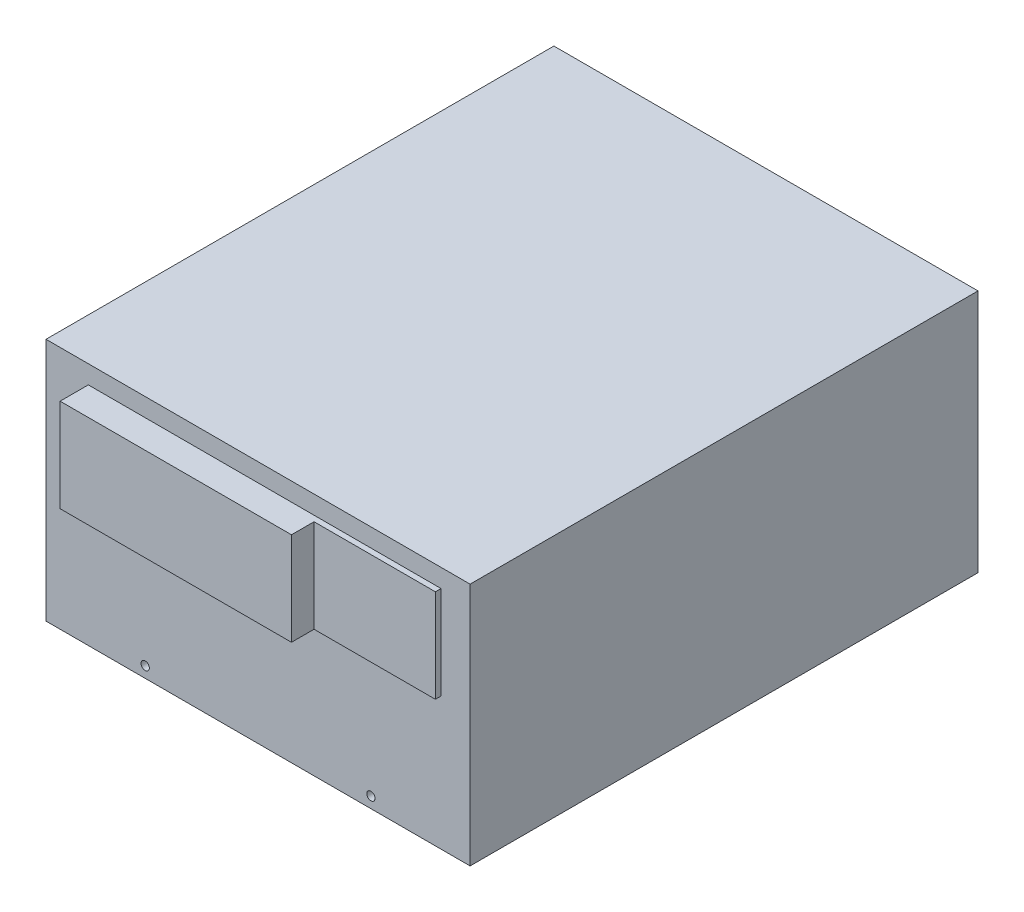
ISO-10303-21;
HEADER;
FILE_DESCRIPTION(('STEP AP214'),'2;1');
FILE_NAME('part.step','',(''),(''),'','','');
FILE_SCHEMA(('AUTOMOTIVE_DESIGN { 1 0 10303 214 1 1 1 1 }'));
ENDSEC;
DATA;
#1=APPLICATION_CONTEXT('core data for automotive mechanical design processes');
#2=APPLICATION_PROTOCOL_DEFINITION('international standard','automotive_design',2000,#1);
#3=PRODUCT_CONTEXT('',#1,'mechanical');
#4=PRODUCT('Part','Part','',(#3));
#5=PRODUCT_RELATED_PRODUCT_CATEGORY('part','',(#4));
#6=PRODUCT_DEFINITION_FORMATION('','',#4);
#7=PRODUCT_DEFINITION_CONTEXT('part definition',#1,'design');
#8=PRODUCT_DEFINITION('design','',#6,#7);
#9=PRODUCT_DEFINITION_SHAPE('','',#8);
#10=(LENGTH_UNIT() NAMED_UNIT(*) SI_UNIT(.MILLI.,.METRE.));
#11=(NAMED_UNIT(*) PLANE_ANGLE_UNIT() SI_UNIT($,.RADIAN.));
#12=(NAMED_UNIT(*) SI_UNIT($,.STERADIAN.) SOLID_ANGLE_UNIT());
#13=UNCERTAINTY_MEASURE_WITH_UNIT(LENGTH_MEASURE(1.E-05),#10,'distance_accuracy_value','');
#14=(GEOMETRIC_REPRESENTATION_CONTEXT(3) GLOBAL_UNCERTAINTY_ASSIGNED_CONTEXT((#13)) GLOBAL_UNIT_ASSIGNED_CONTEXT((#10,
#11,#12)) REPRESENTATION_CONTEXT('',''));
#15=CARTESIAN_POINT('',(0.,0.,0.));
#16=DIRECTION('',(0.,0.,1.));
#17=DIRECTION('',(1.,0.,0.));
#18=AXIS2_PLACEMENT_3D('',#15,#16,#17);
#19=CARTESIAN_POINT('',(0.,0.,0.));
#20=DIRECTION('',(0.,0.,1.));
#21=DIRECTION('',(1.,0.,0.));
#22=AXIS2_PLACEMENT_3D('',#19,#20,#21);
#23=PLANE('',#22);
#24=CARTESIAN_POINT('',(115.15,3.89,0.));
#25=DIRECTION('',(0.,0.,1.));
#26=DIRECTION('',(1.,0.,0.));
#27=AXIS2_PLACEMENT_3D('',#24,#25,#26);
#28=CIRCLE('',#27,1.47000000000001);
#29=CARTESIAN_POINT('',(116.62,3.89,0.));
#30=VERTEX_POINT('',#29);
#31=EDGE_CURVE('E171',#30,#30,#28,.F.);
#32=ORIENTED_EDGE('',*,*,#31,.T.);
#33=EDGE_LOOP('',(#32));
#34=FACE_BOUND('',#33,.T.);
#35=DIRECTION('',(1.,0.,0.));
#36=VECTOR('',#35,1.);
#37=CARTESIAN_POINT('',(0.,0.,0.));
#38=LINE('',#37,#36);
#39=CARTESIAN_POINT('',(0.,0.,0.));
#40=VERTEX_POINT('',#39);
#41=CARTESIAN_POINT('',(150.3,0.,0.));
#42=VERTEX_POINT('',#41);
#43=EDGE_CURVE('E175',#40,#42,#38,.T.);
#44=ORIENTED_EDGE('',*,*,#43,.T.);
#45=DIRECTION('',(0.,1.,0.));
#46=VECTOR('',#45,1.);
#47=CARTESIAN_POINT('',(150.3,0.,0.));
#48=LINE('',#47,#46);
#49=CARTESIAN_POINT('',(150.3,86.5,0.));
#50=VERTEX_POINT('',#49);
#51=EDGE_CURVE('E197',#42,#50,#48,.T.);
#52=ORIENTED_EDGE('',*,*,#51,.T.);
#53=DIRECTION('',(1.,0.,0.));
#54=VECTOR('',#53,1.);
#55=CARTESIAN_POINT('',(0.,86.5,0.));
#56=LINE('',#55,#54);
#57=CARTESIAN_POINT('',(0.,86.5,0.));
#58=VERTEX_POINT('',#57);
#59=EDGE_CURVE('E200',#58,#50,#56,.T.);
#60=ORIENTED_EDGE('',*,*,#59,.F.);
#61=DIRECTION('',(0.,1.,0.));
#62=VECTOR('',#61,1.);
#63=CARTESIAN_POINT('',(0.,0.,0.));
#64=LINE('',#63,#62);
#65=EDGE_CURVE('E188',#40,#58,#64,.T.);
#66=ORIENTED_EDGE('',*,*,#65,.F.);
#67=EDGE_LOOP('',(#44,#52,#60,#66));
#68=FACE_BOUND('',#67,.T.);
#69=CARTESIAN_POINT('',(35.15,3.89,0.));
#70=DIRECTION('',(0.,0.,1.));
#71=DIRECTION('',(1.,0.,0.));
#72=AXIS2_PLACEMENT_3D('',#69,#70,#71);
#73=CIRCLE('',#72,1.47);
#74=CARTESIAN_POINT('',(36.62,3.89,0.));
#75=VERTEX_POINT('',#74);
#76=EDGE_CURVE('E176',#75,#75,#73,.T.);
#77=ORIENTED_EDGE('',*,*,#76,.F.);
#78=EDGE_LOOP('',(#77));
#79=FACE_BOUND('',#78,.T.);
#80=DIRECTION('',(-1.,0.,0.));
#81=VECTOR('',#80,1.);
#82=CARTESIAN_POINT('',(0.,80.,0.));
#83=LINE('',#82,#81);
#84=CARTESIAN_POINT('',(140.,80.,0.));
#85=VERTEX_POINT('',#84);
#86=CARTESIAN_POINT('',(15.,80.,0.));
#87=VERTEX_POINT('',#86);
#88=EDGE_CURVE('E67',#85,#87,#83,.T.);
#89=ORIENTED_EDGE('',*,*,#88,.F.);
#90=DIRECTION('',(0.,1.,0.));
#91=VECTOR('',#90,1.);
#92=CARTESIAN_POINT('',(140.,0.,0.));
#93=LINE('',#92,#91);
#94=CARTESIAN_POINT('',(140.,47.,0.));
#95=VERTEX_POINT('',#94);
#96=EDGE_CURVE('E144',#95,#85,#93,.T.);
#97=ORIENTED_EDGE('',*,*,#96,.F.);
#98=DIRECTION('',(1.,0.,0.));
#99=VECTOR('',#98,1.);
#100=CARTESIAN_POINT('',(0.,47.,0.));
#101=LINE('',#100,#99);
#102=CARTESIAN_POINT('',(15.,47.,0.));
#103=VERTEX_POINT('',#102);
#104=EDGE_CURVE('E60',#103,#95,#101,.T.);
#105=ORIENTED_EDGE('',*,*,#104,.F.);
#106=DIRECTION('',(0.,-1.,0.));
#107=VECTOR('',#106,1.);
#108=CARTESIAN_POINT('',(15.,0.,0.));
#109=LINE('',#108,#107);
#110=EDGE_CURVE('E158',#87,#103,#109,.T.);
#111=ORIENTED_EDGE('',*,*,#110,.F.);
#112=EDGE_LOOP('',(#89,#97,#105,#111));
#113=FACE_BOUND('',#112,.T.);
#114=ADVANCED_FACE('F43',(#34,#68,#79,#113),#23,.T.);
#115=CARTESIAN_POINT('',(0.,0.,-180.));
#116=DIRECTION('',(0.,-1.,0.));
#117=DIRECTION('',(0.,0.,-1.));
#118=AXIS2_PLACEMENT_3D('',#115,#116,#117);
#119=PLANE('',#118);
#120=ORIENTED_EDGE('',*,*,#43,.F.);
#121=DIRECTION('',(0.,0.,1.));
#122=VECTOR('',#121,1.);
#123=CARTESIAN_POINT('',(0.,0.,-180.));
#124=LINE('',#123,#122);
#125=CARTESIAN_POINT('',(0.,0.,-180.));
#126=VERTEX_POINT('',#125);
#127=EDGE_CURVE('E11',#126,#40,#124,.T.);
#128=ORIENTED_EDGE('',*,*,#127,.F.);
#129=DIRECTION('',(1.,0.,0.));
#130=VECTOR('',#129,1.);
#131=CARTESIAN_POINT('',(0.,0.,-180.));
#132=LINE('',#131,#130);
#133=CARTESIAN_POINT('',(150.3,0.,-180.));
#134=VERTEX_POINT('',#133);
#135=EDGE_CURVE('E184',#126,#134,#132,.T.);
#136=ORIENTED_EDGE('',*,*,#135,.T.);
#137=DIRECTION('',(0.,0.,1.));
#138=VECTOR('',#137,1.);
#139=CARTESIAN_POINT('',(150.3,0.,-180.));
#140=LINE('',#139,#138);
#141=EDGE_CURVE('E47',#134,#42,#140,.T.);
#142=ORIENTED_EDGE('',*,*,#141,.T.);
#143=EDGE_LOOP('',(#120,#128,#136,#142));
#144=FACE_BOUND('',#143,.T.);
#145=ADVANCED_FACE('F45',(#144),#119,.T.);
#146=CARTESIAN_POINT('',(0.,0.,-180.));
#147=DIRECTION('',(1.,0.,0.));
#148=DIRECTION('',(0.,0.,-1.));
#149=AXIS2_PLACEMENT_3D('',#146,#147,#148);
#150=PLANE('',#149);
#151=ORIENTED_EDGE('',*,*,#65,.T.);
#152=DIRECTION('',(0.,0.,1.));
#153=VECTOR('',#152,1.);
#154=CARTESIAN_POINT('',(0.,86.5,-180.));
#155=LINE('',#154,#153);
#156=CARTESIAN_POINT('',(0.,86.5,-180.));
#157=VERTEX_POINT('',#156);
#158=EDGE_CURVE('E52',#157,#58,#155,.T.);
#159=ORIENTED_EDGE('',*,*,#158,.F.);
#160=DIRECTION('',(0.,1.,0.));
#161=VECTOR('',#160,1.);
#162=CARTESIAN_POINT('',(0.,0.,-180.));
#163=LINE('',#162,#161);
#164=EDGE_CURVE('E193',#126,#157,#163,.T.);
#165=ORIENTED_EDGE('',*,*,#164,.F.);
#166=ORIENTED_EDGE('',*,*,#127,.T.);
#167=EDGE_LOOP('',(#151,#159,#165,#166));
#168=FACE_BOUND('',#167,.T.);
#169=ADVANCED_FACE('F220',(#168),#150,.F.);
#170=CARTESIAN_POINT('',(0.,86.5,-180.));
#171=DIRECTION('',(0.,-1.,0.));
#172=DIRECTION('',(0.,0.,-1.));
#173=AXIS2_PLACEMENT_3D('',#170,#171,#172);
#174=PLANE('',#173);
#175=ORIENTED_EDGE('',*,*,#59,.T.);
#176=DIRECTION('',(0.,0.,1.));
#177=VECTOR('',#176,1.);
#178=CARTESIAN_POINT('',(150.3,86.5,-180.));
#179=LINE('',#178,#177);
#180=CARTESIAN_POINT('',(150.3,86.5,-180.));
#181=VERTEX_POINT('',#180);
#182=EDGE_CURVE('E205',#181,#50,#179,.T.);
#183=ORIENTED_EDGE('',*,*,#182,.F.);
#184=DIRECTION('',(1.,0.,0.));
#185=VECTOR('',#184,1.);
#186=CARTESIAN_POINT('',(0.,86.5,-180.));
#187=LINE('',#186,#185);
#188=EDGE_CURVE('E191',#157,#181,#187,.T.);
#189=ORIENTED_EDGE('',*,*,#188,.F.);
#190=ORIENTED_EDGE('',*,*,#158,.T.);
#191=EDGE_LOOP('',(#175,#183,#189,#190));
#192=FACE_BOUND('',#191,.T.);
#193=ADVANCED_FACE('F224',(#192),#174,.F.);
#194=CARTESIAN_POINT('',(150.3,0.,-180.));
#195=DIRECTION('',(1.,0.,0.));
#196=DIRECTION('',(0.,0.,-1.));
#197=AXIS2_PLACEMENT_3D('',#194,#195,#196);
#198=PLANE('',#197);
#199=ORIENTED_EDGE('',*,*,#51,.F.);
#200=ORIENTED_EDGE('',*,*,#141,.F.);
#201=DIRECTION('',(0.,1.,0.));
#202=VECTOR('',#201,1.);
#203=CARTESIAN_POINT('',(150.3,0.,-180.));
#204=LINE('',#203,#202);
#205=EDGE_CURVE('E187',#134,#181,#204,.T.);
#206=ORIENTED_EDGE('',*,*,#205,.T.);
#207=ORIENTED_EDGE('',*,*,#182,.T.);
#208=EDGE_LOOP('',(#199,#200,#206,#207));
#209=FACE_BOUND('',#208,.T.);
#210=ADVANCED_FACE('F213',(#209),#198,.T.);
#211=CARTESIAN_POINT('',(0.,0.,-180.));
#212=DIRECTION('',(0.,0.,1.));
#213=DIRECTION('',(1.,0.,0.));
#214=AXIS2_PLACEMENT_3D('',#211,#212,#213);
#215=PLANE('',#214);
#216=ORIENTED_EDGE('',*,*,#135,.F.);
#217=ORIENTED_EDGE('',*,*,#164,.T.);
#218=ORIENTED_EDGE('',*,*,#188,.T.);
#219=ORIENTED_EDGE('',*,*,#205,.F.);
#220=EDGE_LOOP('',(#216,#217,#218,#219));
#221=FACE_BOUND('',#220,.T.);
#222=ADVANCED_FACE('F226',(#221),#215,.F.);
#223=CARTESIAN_POINT('',(115.15,3.89,-10.));
#224=DIRECTION('',(0.,0.,1.));
#225=DIRECTION('',(1.,0.,0.));
#226=AXIS2_PLACEMENT_3D('',#223,#224,#225);
#227=CYLINDRICAL_SURFACE('',#226,1.47000000000001);
#228=CARTESIAN_POINT('',(115.15,3.89,-10.));
#229=DIRECTION('',(0.,0.,1.));
#230=DIRECTION('',(1.,0.,0.));
#231=AXIS2_PLACEMENT_3D('',#228,#229,#230);
#232=CIRCLE('',#231,1.47000000000001);
#233=CARTESIAN_POINT('',(116.62,3.89,-10.));
#234=VERTEX_POINT('',#233);
#235=EDGE_CURVE('E179',#234,#234,#232,.F.);
#236=ORIENTED_EDGE('',*,*,#235,.T.);
#237=EDGE_LOOP('',(#236));
#238=FACE_BOUND('',#237,.T.);
#239=ORIENTED_EDGE('',*,*,#31,.F.);
#240=EDGE_LOOP('',(#239));
#241=FACE_BOUND('',#240,.T.);
#242=ADVANCED_FACE('F228',(#238,#241),#227,.F.);
#243=CARTESIAN_POINT('',(0.,0.,-10.));
#244=DIRECTION('',(0.,0.,1.));
#245=DIRECTION('',(1.,0.,0.));
#246=AXIS2_PLACEMENT_3D('',#243,#244,#245);
#247=PLANE('',#246);
#248=ORIENTED_EDGE('',*,*,#235,.F.);
#249=EDGE_LOOP('',(#248));
#250=FACE_BOUND('',#249,.T.);
#251=ADVANCED_FACE('F234',(#250),#247,.T.);
#252=CARTESIAN_POINT('',(35.15,3.89,-10.));
#253=DIRECTION('',(0.,0.,1.));
#254=DIRECTION('',(1.,0.,0.));
#255=AXIS2_PLACEMENT_3D('',#252,#253,#254);
#256=CYLINDRICAL_SURFACE('',#255,1.47);
#257=CARTESIAN_POINT('',(35.15,3.89,-10.));
#258=DIRECTION('',(0.,0.,1.));
#259=DIRECTION('',(1.,0.,0.));
#260=AXIS2_PLACEMENT_3D('',#257,#258,#259);
#261=CIRCLE('',#260,1.47);
#262=CARTESIAN_POINT('',(36.62,3.89,-10.));
#263=VERTEX_POINT('',#262);
#264=EDGE_CURVE('E172',#263,#263,#261,.T.);
#265=ORIENTED_EDGE('',*,*,#264,.F.);
#266=EDGE_LOOP('',(#265));
#267=FACE_BOUND('',#266,.T.);
#268=ORIENTED_EDGE('',*,*,#76,.T.);
#269=EDGE_LOOP('',(#268));
#270=FACE_BOUND('',#269,.T.);
#271=ADVANCED_FACE('F278',(#267,#270),#256,.F.);
#272=CARTESIAN_POINT('',(0.,0.,-10.));
#273=DIRECTION('',(0.,0.,1.));
#274=DIRECTION('',(1.,0.,0.));
#275=AXIS2_PLACEMENT_3D('',#272,#273,#274);
#276=PLANE('',#275);
#277=ORIENTED_EDGE('',*,*,#264,.T.);
#278=EDGE_LOOP('',(#277));
#279=FACE_BOUND('',#278,.T.);
#280=ADVANCED_FACE('F288',(#279),#276,.T.);
#281=CARTESIAN_POINT('',(97.,0.,10.));
#282=DIRECTION('',(1.,0.,0.));
#283=DIRECTION('',(0.,0.,-1.));
#284=AXIS2_PLACEMENT_3D('',#281,#282,#283);
#285=PLANE('',#284);
#286=DIRECTION('',(0.,-1.,0.));
#287=VECTOR('',#286,1.);
#288=CARTESIAN_POINT('',(97.,0.,2.));
#289=LINE('',#288,#287);
#290=CARTESIAN_POINT('',(97.,80.,2.));
#291=VERTEX_POINT('',#290);
#292=CARTESIAN_POINT('',(97.,47.,2.));
#293=VERTEX_POINT('',#292);
#294=EDGE_CURVE('E128',#291,#293,#289,.T.);
#295=ORIENTED_EDGE('',*,*,#294,.F.);
#296=DIRECTION('',(0.,0.,-1.));
#297=VECTOR('',#296,1.);
#298=CARTESIAN_POINT('',(97.,80.,10.));
#299=LINE('',#298,#297);
#300=CARTESIAN_POINT('',(97.,80.,10.));
#301=VERTEX_POINT('',#300);
#302=EDGE_CURVE('E168',#301,#291,#299,.T.);
#303=ORIENTED_EDGE('',*,*,#302,.F.);
#304=DIRECTION('',(0.,-1.,0.));
#305=VECTOR('',#304,1.);
#306=CARTESIAN_POINT('',(97.,0.,10.));
#307=LINE('',#306,#305);
#308=CARTESIAN_POINT('',(97.,47.,10.));
#309=VERTEX_POINT('',#308);
#310=EDGE_CURVE('E147',#301,#309,#307,.T.);
#311=ORIENTED_EDGE('',*,*,#310,.T.);
#312=DIRECTION('',(0.,0.,-1.));
#313=VECTOR('',#312,1.);
#314=CARTESIAN_POINT('',(97.,47.,10.));
#315=LINE('',#314,#313);
#316=EDGE_CURVE('E156',#309,#293,#315,.T.);
#317=ORIENTED_EDGE('',*,*,#316,.T.);
#318=EDGE_LOOP('',(#295,#303,#311,#317));
#319=FACE_BOUND('',#318,.T.);
#320=ADVANCED_FACE('F298',(#319),#285,.T.);
#321=CARTESIAN_POINT('',(0.,80.,10.));
#322=DIRECTION('',(0.,-1.,0.));
#323=DIRECTION('',(0.,0.,-1.));
#324=AXIS2_PLACEMENT_3D('',#321,#322,#323);
#325=PLANE('',#324);
#326=ORIENTED_EDGE('',*,*,#88,.T.);
#327=DIRECTION('',(0.,0.,-1.));
#328=VECTOR('',#327,1.);
#329=CARTESIAN_POINT('',(15.,80.,10.));
#330=LINE('',#329,#328);
#331=CARTESIAN_POINT('',(15.,80.,10.));
#332=VERTEX_POINT('',#331);
#333=EDGE_CURVE('E165',#332,#87,#330,.T.);
#334=ORIENTED_EDGE('',*,*,#333,.F.);
#335=DIRECTION('',(-1.,0.,0.));
#336=VECTOR('',#335,1.);
#337=CARTESIAN_POINT('',(0.,80.,10.));
#338=LINE('',#337,#336);
#339=EDGE_CURVE('E150',#301,#332,#338,.T.);
#340=ORIENTED_EDGE('',*,*,#339,.F.);
#341=ORIENTED_EDGE('',*,*,#302,.T.);
#342=DIRECTION('',(-1.,0.,0.));
#343=VECTOR('',#342,1.);
#344=CARTESIAN_POINT('',(0.,80.,2.));
#345=LINE('',#344,#343);
#346=CARTESIAN_POINT('',(140.,80.,2.));
#347=VERTEX_POINT('',#346);
#348=EDGE_CURVE('E145',#347,#291,#345,.T.);
#349=ORIENTED_EDGE('',*,*,#348,.F.);
#350=DIRECTION('',(0.,0.,-1.));
#351=VECTOR('',#350,1.);
#352=CARTESIAN_POINT('',(140.,80.,2.));
#353=LINE('',#352,#351);
#354=EDGE_CURVE('E135',#347,#85,#353,.T.);
#355=ORIENTED_EDGE('',*,*,#354,.T.);
#356=EDGE_LOOP('',(#326,#334,#340,#341,#349,#355));
#357=FACE_BOUND('',#356,.T.);
#358=ADVANCED_FACE('F308',(#357),#325,.F.);
#359=CARTESIAN_POINT('',(15.,0.,10.));
#360=DIRECTION('',(1.,0.,0.));
#361=DIRECTION('',(0.,0.,-1.));
#362=AXIS2_PLACEMENT_3D('',#359,#360,#361);
#363=PLANE('',#362);
#364=ORIENTED_EDGE('',*,*,#110,.T.);
#365=DIRECTION('',(0.,0.,-1.));
#366=VECTOR('',#365,1.);
#367=CARTESIAN_POINT('',(15.,47.,10.));
#368=LINE('',#367,#366);
#369=CARTESIAN_POINT('',(15.,47.,10.));
#370=VERTEX_POINT('',#369);
#371=EDGE_CURVE('E163',#370,#103,#368,.T.);
#372=ORIENTED_EDGE('',*,*,#371,.F.);
#373=DIRECTION('',(0.,-1.,0.));
#374=VECTOR('',#373,1.);
#375=CARTESIAN_POINT('',(15.,0.,10.));
#376=LINE('',#375,#374);
#377=EDGE_CURVE('E152',#332,#370,#376,.T.);
#378=ORIENTED_EDGE('',*,*,#377,.F.);
#379=ORIENTED_EDGE('',*,*,#333,.T.);
#380=EDGE_LOOP('',(#364,#372,#378,#379));
#381=FACE_BOUND('',#380,.T.);
#382=ADVANCED_FACE('F319',(#381),#363,.F.);
#383=CARTESIAN_POINT('',(0.,47.,10.));
#384=DIRECTION('',(0.,1.,0.));
#385=DIRECTION('',(0.,0.,1.));
#386=AXIS2_PLACEMENT_3D('',#383,#384,#385);
#387=PLANE('',#386);
#388=ORIENTED_EDGE('',*,*,#104,.T.);
#389=DIRECTION('',(0.,0.,-1.));
#390=VECTOR('',#389,1.);
#391=CARTESIAN_POINT('',(140.,47.,2.));
#392=LINE('',#391,#390);
#393=CARTESIAN_POINT('',(140.,47.,2.));
#394=VERTEX_POINT('',#393);
#395=EDGE_CURVE('E132',#394,#95,#392,.T.);
#396=ORIENTED_EDGE('',*,*,#395,.F.);
#397=DIRECTION('',(1.,0.,0.));
#398=VECTOR('',#397,1.);
#399=CARTESIAN_POINT('',(0.,47.,2.));
#400=LINE('',#399,#398);
#401=EDGE_CURVE('E122',#293,#394,#400,.T.);
#402=ORIENTED_EDGE('',*,*,#401,.F.);
#403=ORIENTED_EDGE('',*,*,#316,.F.);
#404=DIRECTION('',(1.,0.,0.));
#405=VECTOR('',#404,1.);
#406=CARTESIAN_POINT('',(0.,47.,10.));
#407=LINE('',#406,#405);
#408=EDGE_CURVE('E154',#370,#309,#407,.T.);
#409=ORIENTED_EDGE('',*,*,#408,.F.);
#410=ORIENTED_EDGE('',*,*,#371,.T.);
#411=EDGE_LOOP('',(#388,#396,#402,#403,#409,#410));
#412=FACE_BOUND('',#411,.T.);
#413=ADVANCED_FACE('F133',(#412),#387,.F.);
#414=CARTESIAN_POINT('',(0.,0.,10.));
#415=DIRECTION('',(0.,0.,1.));
#416=DIRECTION('',(1.,0.,0.));
#417=AXIS2_PLACEMENT_3D('',#414,#415,#416);
#418=PLANE('',#417);
#419=ORIENTED_EDGE('',*,*,#310,.F.);
#420=ORIENTED_EDGE('',*,*,#339,.T.);
#421=ORIENTED_EDGE('',*,*,#377,.T.);
#422=ORIENTED_EDGE('',*,*,#408,.T.);
#423=EDGE_LOOP('',(#419,#420,#421,#422));
#424=FACE_BOUND('',#423,.T.);
#425=ADVANCED_FACE('F339',(#424),#418,.T.);
#426=CARTESIAN_POINT('',(140.,0.,2.));
#427=DIRECTION('',(-1.,0.,0.));
#428=DIRECTION('',(0.,0.,1.));
#429=AXIS2_PLACEMENT_3D('',#426,#427,#428);
#430=PLANE('',#429);
#431=ORIENTED_EDGE('',*,*,#96,.T.);
#432=ORIENTED_EDGE('',*,*,#354,.F.);
#433=DIRECTION('',(0.,1.,0.));
#434=VECTOR('',#433,1.);
#435=CARTESIAN_POINT('',(140.,0.,2.));
#436=LINE('',#435,#434);
#437=EDGE_CURVE('E126',#394,#347,#436,.T.);
#438=ORIENTED_EDGE('',*,*,#437,.F.);
#439=ORIENTED_EDGE('',*,*,#395,.T.);
#440=EDGE_LOOP('',(#431,#432,#438,#439));
#441=FACE_BOUND('',#440,.T.);
#442=ADVANCED_FACE('F137',(#441),#430,.F.);
#443=CARTESIAN_POINT('',(0.,0.,2.));
#444=DIRECTION('',(0.,0.,1.));
#445=DIRECTION('',(1.,0.,0.));
#446=AXIS2_PLACEMENT_3D('',#443,#444,#445);
#447=PLANE('',#446);
#448=ORIENTED_EDGE('',*,*,#348,.T.);
#449=ORIENTED_EDGE('',*,*,#294,.T.);
#450=ORIENTED_EDGE('',*,*,#401,.T.);
#451=ORIENTED_EDGE('',*,*,#437,.T.);
#452=EDGE_LOOP('',(#448,#449,#450,#451));
#453=FACE_BOUND('',#452,.T.);
#454=ADVANCED_FACE('F124',(#453),#447,.T.);
#455=CLOSED_SHELL('',(#114,#145,#169,#193,#210,#222,#242,#251,#271,#280,#320,#358,#382,#413,
#425,#442,#454));
#456=MANIFOLD_SOLID_BREP('B2',#455);
#457=ADVANCED_BREP_SHAPE_REPRESENTATION('',(#18,#456),#14);
#458=SHAPE_DEFINITION_REPRESENTATION(#9,#457);
ENDSEC;
END-ISO-10303-21;
